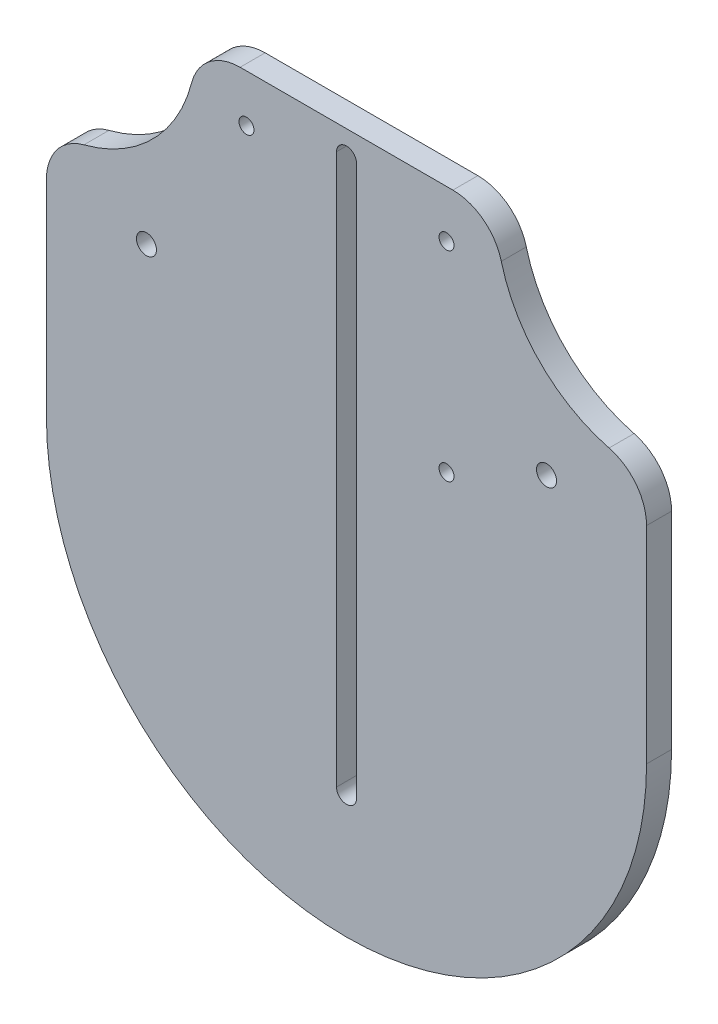
ISO-10303-21;
HEADER;
FILE_DESCRIPTION(('STEP AP214'),'2;1');
FILE_NAME('part.step','',(''),(''),'','','');
FILE_SCHEMA(('AUTOMOTIVE_DESIGN { 1 0 10303 214 1 1 1 1 }'));
ENDSEC;
DATA;
#1=APPLICATION_CONTEXT('core data for automotive mechanical design processes');
#2=APPLICATION_PROTOCOL_DEFINITION('international standard','automotive_design',2000,#1);
#3=PRODUCT_CONTEXT('',#1,'mechanical');
#4=PRODUCT('Part','Part','',(#3));
#5=PRODUCT_RELATED_PRODUCT_CATEGORY('part','',(#4));
#6=PRODUCT_DEFINITION_FORMATION('','',#4);
#7=PRODUCT_DEFINITION_CONTEXT('part definition',#1,'design');
#8=PRODUCT_DEFINITION('design','',#6,#7);
#9=PRODUCT_DEFINITION_SHAPE('','',#8);
#10=(LENGTH_UNIT() NAMED_UNIT(*) SI_UNIT(.MILLI.,.METRE.));
#11=(NAMED_UNIT(*) PLANE_ANGLE_UNIT() SI_UNIT($,.RADIAN.));
#12=(NAMED_UNIT(*) SI_UNIT($,.STERADIAN.) SOLID_ANGLE_UNIT());
#13=UNCERTAINTY_MEASURE_WITH_UNIT(LENGTH_MEASURE(1.E-05),#10,'distance_accuracy_value','');
#14=(GEOMETRIC_REPRESENTATION_CONTEXT(3) GLOBAL_UNCERTAINTY_ASSIGNED_CONTEXT((#13)) GLOBAL_UNIT_ASSIGNED_CONTEXT((#10,
#11,#12)) REPRESENTATION_CONTEXT('',''));
#15=CARTESIAN_POINT('',(0.,0.,0.));
#16=DIRECTION('',(0.,0.,1.));
#17=DIRECTION('',(1.,0.,0.));
#18=AXIS2_PLACEMENT_3D('',#15,#16,#17);
#19=CARTESIAN_POINT('',(60.,-70.,5.));
#20=DIRECTION('',(-1.,0.,0.));
#21=DIRECTION('',(0.,0.,1.));
#22=AXIS2_PLACEMENT_3D('',#19,#20,#21);
#23=PLANE('',#22);
#24=DIRECTION('',(0.,1.,0.));
#25=VECTOR('',#24,1.);
#26=CARTESIAN_POINT('',(60.,-70.,5.));
#27=LINE('',#26,#25);
#28=CARTESIAN_POINT('',(60.,-10.,5.));
#29=VERTEX_POINT('',#28);
#30=CARTESIAN_POINT('',(60.,31.2701665379258,5.));
#31=VERTEX_POINT('',#30);
#32=EDGE_CURVE('E188',#29,#31,#27,.T.);
#33=ORIENTED_EDGE('',*,*,#32,.F.);
#34=DIRECTION('',(0.,0.,-1.));
#35=VECTOR('',#34,1.);
#36=CARTESIAN_POINT('',(60.,-10.,5.));
#37=LINE('',#36,#35);
#38=CARTESIAN_POINT('',(60.,-10.,0.));
#39=VERTEX_POINT('',#38);
#40=EDGE_CURVE('E238',#29,#39,#37,.T.);
#41=ORIENTED_EDGE('',*,*,#40,.T.);
#42=DIRECTION('',(0.,1.,0.));
#43=VECTOR('',#42,1.);
#44=CARTESIAN_POINT('',(60.,-70.,0.));
#45=LINE('',#44,#43);
#46=CARTESIAN_POINT('',(60.,31.2701665379258,0.));
#47=VERTEX_POINT('',#46);
#48=EDGE_CURVE('E187',#39,#47,#45,.T.);
#49=ORIENTED_EDGE('',*,*,#48,.T.);
#50=DIRECTION('',(0.,0.,1.));
#51=VECTOR('',#50,1.);
#52=CARTESIAN_POINT('',(60.,31.2701665379258,5.));
#53=LINE('',#52,#51);
#54=EDGE_CURVE('E225',#47,#31,#53,.T.);
#55=ORIENTED_EDGE('',*,*,#54,.T.);
#56=EDGE_LOOP('',(#33,#41,#49,#55));
#57=FACE_BOUND('',#56,.T.);
#58=ADVANCED_FACE('F33',(#57),#23,.F.);
#59=CARTESIAN_POINT('',(-60.,70.,5.));
#60=DIRECTION('',(0.,-1.,0.));
#61=DIRECTION('',(0.,0.,-1.));
#62=AXIS2_PLACEMENT_3D('',#59,#60,#61);
#63=PLANE('',#62);
#64=DIRECTION('',(-1.,0.,0.));
#65=VECTOR('',#64,1.);
#66=CARTESIAN_POINT('',(-60.,70.,5.));
#67=LINE('',#66,#65);
#68=CARTESIAN_POINT('',(21.2701665379258,70.,5.));
#69=VERTEX_POINT('',#68);
#70=CARTESIAN_POINT('',(-21.2701665379259,70.,5.));
#71=VERTEX_POINT('',#70);
#72=EDGE_CURVE('E190',#69,#71,#67,.T.);
#73=ORIENTED_EDGE('',*,*,#72,.F.);
#74=DIRECTION('',(0.,0.,1.));
#75=VECTOR('',#74,1.);
#76=CARTESIAN_POINT('',(21.2701665379258,70.,5.));
#77=LINE('',#76,#75);
#78=CARTESIAN_POINT('',(21.2701665379258,70.,0.));
#79=VERTEX_POINT('',#78);
#80=EDGE_CURVE('E235',#69,#79,#77,.F.);
#81=ORIENTED_EDGE('',*,*,#80,.T.);
#82=DIRECTION('',(-1.,0.,0.));
#83=VECTOR('',#82,1.);
#84=CARTESIAN_POINT('',(-60.,70.,0.));
#85=LINE('',#84,#83);
#86=CARTESIAN_POINT('',(-21.2701665379259,70.,0.));
#87=VERTEX_POINT('',#86);
#88=EDGE_CURVE('E198',#79,#87,#85,.T.);
#89=ORIENTED_EDGE('',*,*,#88,.T.);
#90=DIRECTION('',(0.,0.,1.));
#91=VECTOR('',#90,1.);
#92=CARTESIAN_POINT('',(-21.2701665379259,70.,5.));
#93=LINE('',#92,#91);
#94=EDGE_CURVE('E232',#87,#71,#93,.T.);
#95=ORIENTED_EDGE('',*,*,#94,.T.);
#96=EDGE_LOOP('',(#73,#81,#89,#95));
#97=FACE_BOUND('',#96,.T.);
#98=ADVANCED_FACE('F325',(#97),#63,.F.);
#99=CARTESIAN_POINT('',(-60.,-70.,5.));
#100=DIRECTION('',(1.,0.,0.));
#101=DIRECTION('',(0.,0.,-1.));
#102=AXIS2_PLACEMENT_3D('',#99,#100,#101);
#103=PLANE('',#102);
#104=DIRECTION('',(0.,-1.,0.));
#105=VECTOR('',#104,1.);
#106=CARTESIAN_POINT('',(-60.,-70.,0.));
#107=LINE('',#106,#105);
#108=CARTESIAN_POINT('',(-60.,31.2701665379258,0.));
#109=VERTEX_POINT('',#108);
#110=CARTESIAN_POINT('',(-60.,-10.,0.));
#111=VERTEX_POINT('',#110);
#112=EDGE_CURVE('E191',#109,#111,#107,.T.);
#113=ORIENTED_EDGE('',*,*,#112,.T.);
#114=DIRECTION('',(0.,0.,-1.));
#115=VECTOR('',#114,1.);
#116=CARTESIAN_POINT('',(-60.,-10.,5.));
#117=LINE('',#116,#115);
#118=CARTESIAN_POINT('',(-60.,-10.,5.));
#119=VERTEX_POINT('',#118);
#120=EDGE_CURVE('E11',#111,#119,#117,.F.);
#121=ORIENTED_EDGE('',*,*,#120,.T.);
#122=DIRECTION('',(0.,-1.,0.));
#123=VECTOR('',#122,1.);
#124=CARTESIAN_POINT('',(-60.,-70.,5.));
#125=LINE('',#124,#123);
#126=CARTESIAN_POINT('',(-60.,31.2701665379258,5.));
#127=VERTEX_POINT('',#126);
#128=EDGE_CURVE('E194',#127,#119,#125,.T.);
#129=ORIENTED_EDGE('',*,*,#128,.F.);
#130=DIRECTION('',(0.,0.,1.));
#131=VECTOR('',#130,1.);
#132=CARTESIAN_POINT('',(-60.,31.2701665379258,5.));
#133=LINE('',#132,#131);
#134=EDGE_CURVE('E196',#127,#109,#133,.F.);
#135=ORIENTED_EDGE('',*,*,#134,.T.);
#136=EDGE_LOOP('',(#113,#121,#129,#135));
#137=FACE_BOUND('',#136,.T.);
#138=ADVANCED_FACE('F330',(#137),#103,.F.);
#139=CARTESIAN_POINT('',(0.,0.,5.));
#140=DIRECTION('',(0.,0.,-1.));
#141=DIRECTION('',(-1.,0.,0.));
#142=AXIS2_PLACEMENT_3D('',#139,#140,#141);
#143=PLANE('',#142);
#144=CARTESIAN_POINT('',(20.,20.5,5.));
#145=DIRECTION('',(0.,0.,1.));
#146=DIRECTION('',(1.,0.,0.));
#147=AXIS2_PLACEMENT_3D('',#144,#145,#146);
#148=CIRCLE('',#147,1.5);
#149=CARTESIAN_POINT('',(21.5,20.5,5.));
#150=VERTEX_POINT('',#149);
#151=EDGE_CURVE('E287',#150,#150,#148,.T.);
#152=ORIENTED_EDGE('',*,*,#151,.F.);
#153=EDGE_LOOP('',(#152));
#154=FACE_BOUND('',#153,.T.);
#155=CARTESIAN_POINT('',(20.,60.5,5.));
#156=DIRECTION('',(0.,0.,1.));
#157=DIRECTION('',(1.,0.,0.));
#158=AXIS2_PLACEMENT_3D('',#155,#156,#157);
#159=CIRCLE('',#158,1.5);
#160=CARTESIAN_POINT('',(21.5,60.5,5.));
#161=VERTEX_POINT('',#160);
#162=EDGE_CURVE('E293',#161,#161,#159,.T.);
#163=ORIENTED_EDGE('',*,*,#162,.F.);
#164=EDGE_LOOP('',(#163));
#165=FACE_BOUND('',#164,.T.);
#166=CARTESIAN_POINT('',(-20.,60.5,5.));
#167=DIRECTION('',(0.,0.,1.));
#168=DIRECTION('',(1.,0.,0.));
#169=AXIS2_PLACEMENT_3D('',#166,#167,#168);
#170=CIRCLE('',#169,1.5);
#171=CARTESIAN_POINT('',(-18.5,60.5,5.));
#172=VERTEX_POINT('',#171);
#173=EDGE_CURVE('E299',#172,#172,#170,.T.);
#174=ORIENTED_EDGE('',*,*,#173,.F.);
#175=EDGE_LOOP('',(#174));
#176=FACE_BOUND('',#175,.T.);
#177=CARTESIAN_POINT('',(0.,65.,5.));
#178=DIRECTION('',(0.,0.,1.));
#179=DIRECTION('',(1.,0.,0.));
#180=AXIS2_PLACEMENT_3D('',#177,#178,#179);
#181=CIRCLE('',#180,2.);
#182=CARTESIAN_POINT('',(1.99999999999998,65.0000000263186,5.));
#183=VERTEX_POINT('',#182);
#184=CARTESIAN_POINT('',(-2.,65.0000000263186,5.));
#185=VERTEX_POINT('',#184);
#186=EDGE_CURVE('E159',#183,#185,#181,.T.);
#187=ORIENTED_EDGE('',*,*,#186,.F.);
#188=DIRECTION('',(0.,1.,0.));
#189=VECTOR('',#188,1.);
#190=CARTESIAN_POINT('',(1.99999999999998,65.0000000263186,5.));
#191=LINE('',#190,#189);
#192=CARTESIAN_POINT('',(2.,-45.0000005346875,5.));
#193=VERTEX_POINT('',#192);
#194=EDGE_CURVE('E162',#193,#183,#191,.T.);
#195=ORIENTED_EDGE('',*,*,#194,.F.);
#196=CARTESIAN_POINT('',(0.,-45.,5.));
#197=DIRECTION('',(0.,0.,1.));
#198=DIRECTION('',(1.,0.,0.));
#199=AXIS2_PLACEMENT_3D('',#196,#197,#198);
#200=CIRCLE('',#199,2.);
#201=CARTESIAN_POINT('',(-2.,-45.,5.));
#202=VERTEX_POINT('',#201);
#203=EDGE_CURVE('E161',#202,#193,#200,.T.);
#204=ORIENTED_EDGE('',*,*,#203,.F.);
#205=DIRECTION('',(0.,-1.,0.));
#206=VECTOR('',#205,1.);
#207=CARTESIAN_POINT('',(-2.,65.0000000263186,5.));
#208=LINE('',#207,#206);
#209=EDGE_CURVE('E143',#185,#202,#208,.T.);
#210=ORIENTED_EDGE('',*,*,#209,.F.);
#211=EDGE_LOOP('',(#187,#195,#204,#210));
#212=FACE_BOUND('',#211,.T.);
#213=CARTESIAN_POINT('',(40.,30.,5.));
#214=DIRECTION('',(0.,0.,1.));
#215=DIRECTION('',(1.,0.,0.));
#216=AXIS2_PLACEMENT_3D('',#213,#214,#215);
#217=CIRCLE('',#216,2.);
#218=CARTESIAN_POINT('',(42.,30.,5.));
#219=VERTEX_POINT('',#218);
#220=EDGE_CURVE('E170',#219,#219,#217,.T.);
#221=ORIENTED_EDGE('',*,*,#220,.F.);
#222=EDGE_LOOP('',(#221));
#223=FACE_BOUND('',#222,.T.);
#224=CARTESIAN_POINT('',(-40.,30.,5.));
#225=DIRECTION('',(0.,0.,1.));
#226=DIRECTION('',(1.,0.,0.));
#227=AXIS2_PLACEMENT_3D('',#224,#225,#226);
#228=CIRCLE('',#227,2.);
#229=CARTESIAN_POINT('',(-38.,30.,5.));
#230=VERTEX_POINT('',#229);
#231=EDGE_CURVE('E181',#230,#230,#228,.T.);
#232=ORIENTED_EDGE('',*,*,#231,.F.);
#233=EDGE_LOOP('',(#232));
#234=FACE_BOUND('',#233,.T.);
#235=CARTESIAN_POINT('',(0.,-10.,5.));
#236=DIRECTION('',(0.,0.,-1.));
#237=DIRECTION('',(-1.,0.,0.));
#238=AXIS2_PLACEMENT_3D('',#235,#236,#237);
#239=CIRCLE('',#238,60.);
#240=CARTESIAN_POINT('',(0.,-70.,5.));
#241=VERTEX_POINT('',#240);
#242=EDGE_CURVE('E49',#119,#241,#239,.F.);
#243=ORIENTED_EDGE('',*,*,#242,.T.);
#244=CARTESIAN_POINT('',(0.,-10.,5.));
#245=DIRECTION('',(0.,0.,-1.));
#246=DIRECTION('',(-1.,0.,0.));
#247=AXIS2_PLACEMENT_3D('',#244,#245,#246);
#248=CIRCLE('',#247,60.);
#249=EDGE_CURVE('E42',#241,#29,#248,.F.);
#250=ORIENTED_EDGE('',*,*,#249,.T.);
#251=ORIENTED_EDGE('',*,*,#32,.T.);
#252=CARTESIAN_POINT('',(50.,31.2701665379258,5.));
#253=DIRECTION('',(0.,0.,-1.));
#254=DIRECTION('',(-1.,0.,0.));
#255=AXIS2_PLACEMENT_3D('',#252,#253,#254);
#256=CIRCLE('',#255,10.);
#257=CARTESIAN_POINT('',(52.5,40.9526249034444,5.));
#258=VERTEX_POINT('',#257);
#259=EDGE_CURVE('E221',#31,#258,#256,.F.);
#260=ORIENTED_EDGE('',*,*,#259,.T.);
#261=CARTESIAN_POINT('',(60.,70.,5.));
#262=DIRECTION('',(0.,0.,1.));
#263=DIRECTION('',(1.,0.,0.));
#264=AXIS2_PLACEMENT_3D('',#261,#262,#263);
#265=CIRCLE('',#264,30.);
#266=CARTESIAN_POINT('',(30.9526249034444,62.5,5.));
#267=VERTEX_POINT('',#266);
#268=EDGE_CURVE('E262',#267,#258,#265,.T.);
#269=ORIENTED_EDGE('',*,*,#268,.F.);
#270=CARTESIAN_POINT('',(21.2701665379258,60.,5.));
#271=DIRECTION('',(0.,0.,-1.));
#272=DIRECTION('',(-1.,0.,0.));
#273=AXIS2_PLACEMENT_3D('',#270,#271,#272);
#274=CIRCLE('',#273,10.);
#275=EDGE_CURVE('E219',#267,#69,#274,.F.);
#276=ORIENTED_EDGE('',*,*,#275,.T.);
#277=ORIENTED_EDGE('',*,*,#72,.T.);
#278=CARTESIAN_POINT('',(-21.2701665379259,60.,5.));
#279=DIRECTION('',(0.,0.,-1.));
#280=DIRECTION('',(-1.,0.,0.));
#281=AXIS2_PLACEMENT_3D('',#278,#279,#280);
#282=CIRCLE('',#281,10.);
#283=CARTESIAN_POINT('',(-30.9526249034444,62.5,5.));
#284=VERTEX_POINT('',#283);
#285=EDGE_CURVE('E217',#71,#284,#282,.F.);
#286=ORIENTED_EDGE('',*,*,#285,.T.);
#287=CARTESIAN_POINT('',(-60.,70.,5.));
#288=DIRECTION('',(0.,0.,1.));
#289=DIRECTION('',(1.,0.,0.));
#290=AXIS2_PLACEMENT_3D('',#287,#288,#289);
#291=CIRCLE('',#290,30.);
#292=CARTESIAN_POINT('',(-52.5,40.9526249034444,5.));
#293=VERTEX_POINT('',#292);
#294=EDGE_CURVE('E270',#293,#284,#291,.T.);
#295=ORIENTED_EDGE('',*,*,#294,.F.);
#296=CARTESIAN_POINT('',(-50.,31.2701665379258,5.));
#297=DIRECTION('',(0.,0.,-1.));
#298=DIRECTION('',(-1.,0.,0.));
#299=AXIS2_PLACEMENT_3D('',#296,#297,#298);
#300=CIRCLE('',#299,10.);
#301=EDGE_CURVE('E223',#293,#127,#300,.F.);
#302=ORIENTED_EDGE('',*,*,#301,.T.);
#303=ORIENTED_EDGE('',*,*,#128,.T.);
#304=EDGE_LOOP('',(#243,#250,#251,#260,#269,#276,#277,#286,#295,#302,#303));
#305=FACE_BOUND('',#304,.T.);
#306=ADVANCED_FACE('F156',(#154,#165,#176,#212,#223,#234,#305),#143,.F.);
#307=CARTESIAN_POINT('',(0.,0.,0.));
#308=DIRECTION('',(0.,0.,-1.));
#309=DIRECTION('',(-1.,0.,0.));
#310=AXIS2_PLACEMENT_3D('',#307,#308,#309);
#311=PLANE('',#310);
#312=ORIENTED_EDGE('',*,*,#48,.F.);
#313=CARTESIAN_POINT('',(0.,-10.,0.));
#314=DIRECTION('',(0.,0.,-1.));
#315=DIRECTION('',(-1.,0.,0.));
#316=AXIS2_PLACEMENT_3D('',#313,#314,#315);
#317=CIRCLE('',#316,60.);
#318=CARTESIAN_POINT('',(0.,-70.,0.));
#319=VERTEX_POINT('',#318);
#320=EDGE_CURVE('E243',#39,#319,#317,.T.);
#321=ORIENTED_EDGE('',*,*,#320,.T.);
#322=CARTESIAN_POINT('',(0.,-10.,0.));
#323=DIRECTION('',(0.,0.,-1.));
#324=DIRECTION('',(-1.,0.,0.));
#325=AXIS2_PLACEMENT_3D('',#322,#323,#324);
#326=CIRCLE('',#325,60.);
#327=EDGE_CURVE('E241',#319,#111,#326,.T.);
#328=ORIENTED_EDGE('',*,*,#327,.T.);
#329=ORIENTED_EDGE('',*,*,#112,.F.);
#330=CARTESIAN_POINT('',(-50.,31.2701665379258,0.));
#331=DIRECTION('',(0.,0.,-1.));
#332=DIRECTION('',(-1.,0.,0.));
#333=AXIS2_PLACEMENT_3D('',#330,#331,#332);
#334=CIRCLE('',#333,10.);
#335=CARTESIAN_POINT('',(-52.5,40.9526249034444,0.));
#336=VERTEX_POINT('',#335);
#337=EDGE_CURVE('E211',#109,#336,#334,.T.);
#338=ORIENTED_EDGE('',*,*,#337,.T.);
#339=CARTESIAN_POINT('',(-60.,70.,0.));
#340=DIRECTION('',(0.,0.,-1.));
#341=DIRECTION('',(-1.,0.,0.));
#342=AXIS2_PLACEMENT_3D('',#339,#340,#341);
#343=CIRCLE('',#342,30.);
#344=CARTESIAN_POINT('',(-30.9526249034444,62.5,0.));
#345=VERTEX_POINT('',#344);
#346=EDGE_CURVE('E163',#336,#345,#343,.F.);
#347=ORIENTED_EDGE('',*,*,#346,.T.);
#348=CARTESIAN_POINT('',(-21.2701665379259,60.,0.));
#349=DIRECTION('',(0.,0.,-1.));
#350=DIRECTION('',(-1.,0.,0.));
#351=AXIS2_PLACEMENT_3D('',#348,#349,#350);
#352=CIRCLE('',#351,10.);
#353=EDGE_CURVE('E204',#345,#87,#352,.T.);
#354=ORIENTED_EDGE('',*,*,#353,.T.);
#355=ORIENTED_EDGE('',*,*,#88,.F.);
#356=CARTESIAN_POINT('',(21.2701665379258,60.,0.));
#357=DIRECTION('',(0.,0.,-1.));
#358=DIRECTION('',(-1.,0.,0.));
#359=AXIS2_PLACEMENT_3D('',#356,#357,#358);
#360=CIRCLE('',#359,10.);
#361=CARTESIAN_POINT('',(30.9526249034444,62.5,0.));
#362=VERTEX_POINT('',#361);
#363=EDGE_CURVE('E206',#79,#362,#360,.T.);
#364=ORIENTED_EDGE('',*,*,#363,.T.);
#365=CARTESIAN_POINT('',(60.,70.,0.));
#366=DIRECTION('',(0.,0.,-1.));
#367=DIRECTION('',(-1.,0.,0.));
#368=AXIS2_PLACEMENT_3D('',#365,#366,#367);
#369=CIRCLE('',#368,30.);
#370=CARTESIAN_POINT('',(52.5,40.9526249034444,0.));
#371=VERTEX_POINT('',#370);
#372=EDGE_CURVE('E264',#362,#371,#369,.F.);
#373=ORIENTED_EDGE('',*,*,#372,.T.);
#374=CARTESIAN_POINT('',(50.,31.2701665379258,0.));
#375=DIRECTION('',(0.,0.,-1.));
#376=DIRECTION('',(-1.,0.,0.));
#377=AXIS2_PLACEMENT_3D('',#374,#375,#376);
#378=CIRCLE('',#377,10.);
#379=EDGE_CURVE('E208',#371,#47,#378,.T.);
#380=ORIENTED_EDGE('',*,*,#379,.T.);
#381=EDGE_LOOP('',(#312,#321,#328,#329,#338,#347,#354,#355,#364,#373,#380));
#382=FACE_BOUND('',#381,.T.);
#383=DIRECTION('',(0.,1.,0.));
#384=VECTOR('',#383,1.);
#385=CARTESIAN_POINT('',(1.99999999999998,65.0000000263186,0.));
#386=LINE('',#385,#384);
#387=CARTESIAN_POINT('',(2.,-45.,0.));
#388=VERTEX_POINT('',#387);
#389=CARTESIAN_POINT('',(1.99999999999998,65.0000000263186,0.));
#390=VERTEX_POINT('',#389);
#391=EDGE_CURVE('E281',#388,#390,#386,.T.);
#392=ORIENTED_EDGE('',*,*,#391,.T.);
#393=CARTESIAN_POINT('',(0.,65.,0.));
#394=DIRECTION('',(0.,0.,-1.));
#395=DIRECTION('',(-1.,0.,0.));
#396=AXIS2_PLACEMENT_3D('',#393,#394,#395);
#397=CIRCLE('',#396,2.);
#398=CARTESIAN_POINT('',(-2.,65.0000000263186,0.));
#399=VERTEX_POINT('',#398);
#400=EDGE_CURVE('E167',#390,#399,#397,.F.);
#401=ORIENTED_EDGE('',*,*,#400,.T.);
#402=DIRECTION('',(0.,-1.,0.));
#403=VECTOR('',#402,1.);
#404=CARTESIAN_POINT('',(-2.,65.0000000263186,0.));
#405=LINE('',#404,#403);
#406=CARTESIAN_POINT('',(-2.,-45.0000005346875,0.));
#407=VERTEX_POINT('',#406);
#408=EDGE_CURVE('E146',#399,#407,#405,.T.);
#409=ORIENTED_EDGE('',*,*,#408,.T.);
#410=CARTESIAN_POINT('',(0.,-45.,0.));
#411=DIRECTION('',(0.,0.,-1.));
#412=DIRECTION('',(-1.,0.,0.));
#413=AXIS2_PLACEMENT_3D('',#410,#411,#412);
#414=CIRCLE('',#413,2.);
#415=EDGE_CURVE('E168',#407,#388,#414,.F.);
#416=ORIENTED_EDGE('',*,*,#415,.T.);
#417=EDGE_LOOP('',(#392,#401,#409,#416));
#418=FACE_BOUND('',#417,.T.);
#419=CARTESIAN_POINT('',(20.,20.5,0.));
#420=DIRECTION('',(0.,0.,-1.));
#421=DIRECTION('',(-1.,0.,0.));
#422=AXIS2_PLACEMENT_3D('',#419,#420,#421);
#423=CIRCLE('',#422,1.5);
#424=CARTESIAN_POINT('',(18.5,20.5,0.));
#425=VERTEX_POINT('',#424);
#426=EDGE_CURVE('E290',#425,#425,#423,.F.);
#427=ORIENTED_EDGE('',*,*,#426,.T.);
#428=EDGE_LOOP('',(#427));
#429=FACE_BOUND('',#428,.T.);
#430=CARTESIAN_POINT('',(20.,60.5,0.));
#431=DIRECTION('',(0.,0.,-1.));
#432=DIRECTION('',(-1.,0.,0.));
#433=AXIS2_PLACEMENT_3D('',#430,#431,#432);
#434=CIRCLE('',#433,1.5);
#435=CARTESIAN_POINT('',(18.5,60.5,0.));
#436=VERTEX_POINT('',#435);
#437=EDGE_CURVE('E296',#436,#436,#434,.F.);
#438=ORIENTED_EDGE('',*,*,#437,.T.);
#439=EDGE_LOOP('',(#438));
#440=FACE_BOUND('',#439,.T.);
#441=CARTESIAN_POINT('',(-20.,60.5,0.));
#442=DIRECTION('',(0.,0.,-1.));
#443=DIRECTION('',(-1.,0.,0.));
#444=AXIS2_PLACEMENT_3D('',#441,#442,#443);
#445=CIRCLE('',#444,1.5);
#446=CARTESIAN_POINT('',(-21.5,60.5,0.));
#447=VERTEX_POINT('',#446);
#448=EDGE_CURVE('E302',#447,#447,#445,.F.);
#449=ORIENTED_EDGE('',*,*,#448,.T.);
#450=EDGE_LOOP('',(#449));
#451=FACE_BOUND('',#450,.T.);
#452=CARTESIAN_POINT('',(40.,30.,0.));
#453=DIRECTION('',(0.,0.,-1.));
#454=DIRECTION('',(-1.,0.,0.));
#455=AXIS2_PLACEMENT_3D('',#452,#453,#454);
#456=CIRCLE('',#455,2.);
#457=CARTESIAN_POINT('',(38.,30.,0.));
#458=VERTEX_POINT('',#457);
#459=EDGE_CURVE('E178',#458,#458,#456,.F.);
#460=ORIENTED_EDGE('',*,*,#459,.T.);
#461=EDGE_LOOP('',(#460));
#462=FACE_BOUND('',#461,.T.);
#463=CARTESIAN_POINT('',(-40.,30.,0.));
#464=DIRECTION('',(0.,0.,-1.));
#465=DIRECTION('',(-1.,0.,0.));
#466=AXIS2_PLACEMENT_3D('',#463,#464,#465);
#467=CIRCLE('',#466,2.);
#468=CARTESIAN_POINT('',(-42.,30.,0.));
#469=VERTEX_POINT('',#468);
#470=EDGE_CURVE('E184',#469,#469,#467,.F.);
#471=ORIENTED_EDGE('',*,*,#470,.T.);
#472=EDGE_LOOP('',(#471));
#473=FACE_BOUND('',#472,.T.);
#474=ADVANCED_FACE('F258',(#382,#418,#429,#440,#451,#462,#473),#311,.T.);
#475=CARTESIAN_POINT('',(-40.,30.,-5.65685424949239));
#476=DIRECTION('',(0.,0.,1.));
#477=DIRECTION('',(1.,0.,0.));
#478=AXIS2_PLACEMENT_3D('',#475,#476,#477);
#479=CYLINDRICAL_SURFACE('',#478,2.);
#480=ORIENTED_EDGE('',*,*,#231,.T.);
#481=EDGE_LOOP('',(#480));
#482=FACE_BOUND('',#481,.T.);
#483=ORIENTED_EDGE('',*,*,#470,.F.);
#484=EDGE_LOOP('',(#483));
#485=FACE_BOUND('',#484,.T.);
#486=ADVANCED_FACE('F456',(#482,#485),#479,.F.);
#487=CARTESIAN_POINT('',(40.,30.,-5.65685424949239));
#488=DIRECTION('',(0.,0.,1.));
#489=DIRECTION('',(1.,0.,0.));
#490=AXIS2_PLACEMENT_3D('',#487,#488,#489);
#491=CYLINDRICAL_SURFACE('',#490,2.);
#492=ORIENTED_EDGE('',*,*,#220,.T.);
#493=EDGE_LOOP('',(#492));
#494=FACE_BOUND('',#493,.T.);
#495=ORIENTED_EDGE('',*,*,#459,.F.);
#496=EDGE_LOOP('',(#495));
#497=FACE_BOUND('',#496,.T.);
#498=ADVANCED_FACE('F424',(#494,#497),#491,.F.);
#499=CARTESIAN_POINT('',(0.,65.,-5.65685424949239));
#500=DIRECTION('',(0.,0.,1.));
#501=DIRECTION('',(1.,0.,0.));
#502=AXIS2_PLACEMENT_3D('',#499,#500,#501);
#503=CYLINDRICAL_SURFACE('',#502,2.);
#504=ORIENTED_EDGE('',*,*,#400,.F.);
#505=DIRECTION('',(0.,0.,1.));
#506=VECTOR('',#505,1.);
#507=CARTESIAN_POINT('',(1.99999999999998,65.0000000263186,-110.072703807172));
#508=LINE('',#507,#506);
#509=EDGE_CURVE('E151',#390,#183,#508,.T.);
#510=ORIENTED_EDGE('',*,*,#509,.T.);
#511=ORIENTED_EDGE('',*,*,#186,.T.);
#512=DIRECTION('',(0.,0.,1.));
#513=VECTOR('',#512,1.);
#514=CARTESIAN_POINT('',(-2.,65.0000000263186,-110.072703807172));
#515=LINE('',#514,#513);
#516=EDGE_CURVE('E140',#399,#185,#515,.T.);
#517=ORIENTED_EDGE('',*,*,#516,.F.);
#518=EDGE_LOOP('',(#504,#510,#511,#517));
#519=FACE_BOUND('',#518,.T.);
#520=ADVANCED_FACE('F166',(#519),#503,.F.);
#521=CARTESIAN_POINT('',(0.,-45.,-5.65685424949239));
#522=DIRECTION('',(0.,0.,1.));
#523=DIRECTION('',(1.,0.,0.));
#524=AXIS2_PLACEMENT_3D('',#521,#522,#523);
#525=CYLINDRICAL_SURFACE('',#524,2.);
#526=ORIENTED_EDGE('',*,*,#203,.T.);
#527=DIRECTION('',(0.,0.,1.));
#528=VECTOR('',#527,1.);
#529=CARTESIAN_POINT('',(2.,-45.0000005346875,-110.072703807172));
#530=LINE('',#529,#528);
#531=EDGE_CURVE('E277',#388,#193,#530,.T.);
#532=ORIENTED_EDGE('',*,*,#531,.F.);
#533=ORIENTED_EDGE('',*,*,#415,.F.);
#534=DIRECTION('',(0.,0.,1.));
#535=VECTOR('',#534,1.);
#536=CARTESIAN_POINT('',(-2.,-45.0000005346875,-110.072703807172));
#537=LINE('',#536,#535);
#538=EDGE_CURVE('E280',#407,#202,#537,.T.);
#539=ORIENTED_EDGE('',*,*,#538,.T.);
#540=EDGE_LOOP('',(#526,#532,#533,#539));
#541=FACE_BOUND('',#540,.T.);
#542=ADVANCED_FACE('F306',(#541),#525,.F.);
#543=CARTESIAN_POINT('',(-20.,60.5,-5.65685424949239));
#544=DIRECTION('',(0.,0.,1.));
#545=DIRECTION('',(1.,0.,0.));
#546=AXIS2_PLACEMENT_3D('',#543,#544,#545);
#547=CYLINDRICAL_SURFACE('',#546,1.5);
#548=ORIENTED_EDGE('',*,*,#173,.T.);
#549=EDGE_LOOP('',(#548));
#550=FACE_BOUND('',#549,.T.);
#551=ORIENTED_EDGE('',*,*,#448,.F.);
#552=EDGE_LOOP('',(#551));
#553=FACE_BOUND('',#552,.T.);
#554=ADVANCED_FACE('F413',(#550,#553),#547,.F.);
#555=CARTESIAN_POINT('',(20.,60.5,-5.65685424949239));
#556=DIRECTION('',(0.,0.,1.));
#557=DIRECTION('',(1.,0.,0.));
#558=AXIS2_PLACEMENT_3D('',#555,#556,#557);
#559=CYLINDRICAL_SURFACE('',#558,1.5);
#560=ORIENTED_EDGE('',*,*,#162,.T.);
#561=EDGE_LOOP('',(#560));
#562=FACE_BOUND('',#561,.T.);
#563=ORIENTED_EDGE('',*,*,#437,.F.);
#564=EDGE_LOOP('',(#563));
#565=FACE_BOUND('',#564,.T.);
#566=ADVANCED_FACE('F433',(#562,#565),#559,.F.);
#567=CARTESIAN_POINT('',(20.,20.5,-5.65685424949239));
#568=DIRECTION('',(0.,0.,1.));
#569=DIRECTION('',(1.,0.,0.));
#570=AXIS2_PLACEMENT_3D('',#567,#568,#569);
#571=CYLINDRICAL_SURFACE('',#570,1.5);
#572=ORIENTED_EDGE('',*,*,#151,.T.);
#573=EDGE_LOOP('',(#572));
#574=FACE_BOUND('',#573,.T.);
#575=ORIENTED_EDGE('',*,*,#426,.F.);
#576=EDGE_LOOP('',(#575));
#577=FACE_BOUND('',#576,.T.);
#578=ADVANCED_FACE('F321',(#574,#577),#571,.F.);
#579=CARTESIAN_POINT('',(-2.,65.0000000263186,-110.072703807172));
#580=DIRECTION('',(-1.,0.,0.));
#581=DIRECTION('',(0.,-1.,0.));
#582=AXIS2_PLACEMENT_3D('',#579,#580,#581);
#583=PLANE('',#582);
#584=ORIENTED_EDGE('',*,*,#516,.T.);
#585=ORIENTED_EDGE('',*,*,#209,.T.);
#586=ORIENTED_EDGE('',*,*,#538,.F.);
#587=ORIENTED_EDGE('',*,*,#408,.F.);
#588=EDGE_LOOP('',(#584,#585,#586,#587));
#589=FACE_BOUND('',#588,.T.);
#590=ADVANCED_FACE('F142',(#589),#583,.F.);
#591=CARTESIAN_POINT('',(1.99999999999998,65.0000000263186,-110.072703807172));
#592=DIRECTION('',(1.,0.,0.));
#593=DIRECTION('',(0.,1.,0.));
#594=AXIS2_PLACEMENT_3D('',#591,#592,#593);
#595=PLANE('',#594);
#596=ORIENTED_EDGE('',*,*,#531,.T.);
#597=ORIENTED_EDGE('',*,*,#194,.T.);
#598=ORIENTED_EDGE('',*,*,#509,.F.);
#599=ORIENTED_EDGE('',*,*,#391,.F.);
#600=EDGE_LOOP('',(#596,#597,#598,#599));
#601=FACE_BOUND('',#600,.T.);
#602=ADVANCED_FACE('F310',(#601),#595,.F.);
#603=CARTESIAN_POINT('',(-60.,70.,-84.8528137423857));
#604=DIRECTION('',(0.,0.,1.));
#605=DIRECTION('',(1.,0.,0.));
#606=AXIS2_PLACEMENT_3D('',#603,#604,#605);
#607=CYLINDRICAL_SURFACE('',#606,30.);
#608=ORIENTED_EDGE('',*,*,#346,.F.);
#609=DIRECTION('',(0.,0.,1.));
#610=VECTOR('',#609,1.);
#611=CARTESIAN_POINT('',(-52.5,40.9526249034444,-84.8528137423857));
#612=LINE('',#611,#610);
#613=EDGE_CURVE('E215',#336,#293,#612,.T.);
#614=ORIENTED_EDGE('',*,*,#613,.T.);
#615=ORIENTED_EDGE('',*,*,#294,.T.);
#616=DIRECTION('',(0.,0.,1.));
#617=VECTOR('',#616,1.);
#618=CARTESIAN_POINT('',(-30.9526249034444,62.5,-84.8528137423857));
#619=LINE('',#618,#617);
#620=EDGE_CURVE('E213',#284,#345,#619,.F.);
#621=ORIENTED_EDGE('',*,*,#620,.T.);
#622=EDGE_LOOP('',(#608,#614,#615,#621));
#623=FACE_BOUND('',#622,.T.);
#624=ADVANCED_FACE('F312',(#623),#607,.F.);
#625=CARTESIAN_POINT('',(60.,70.,-84.8528137423857));
#626=DIRECTION('',(0.,0.,1.));
#627=DIRECTION('',(1.,0.,0.));
#628=AXIS2_PLACEMENT_3D('',#625,#626,#627);
#629=CYLINDRICAL_SURFACE('',#628,30.);
#630=ORIENTED_EDGE('',*,*,#268,.T.);
#631=DIRECTION('',(0.,0.,1.));
#632=VECTOR('',#631,1.);
#633=CARTESIAN_POINT('',(52.5,40.9526249034444,-84.8528137423857));
#634=LINE('',#633,#632);
#635=EDGE_CURVE('E230',#258,#371,#634,.F.);
#636=ORIENTED_EDGE('',*,*,#635,.T.);
#637=ORIENTED_EDGE('',*,*,#372,.F.);
#638=DIRECTION('',(0.,0.,1.));
#639=VECTOR('',#638,1.);
#640=CARTESIAN_POINT('',(30.9526249034444,62.5,-84.8528137423857));
#641=LINE('',#640,#639);
#642=EDGE_CURVE('E228',#362,#267,#641,.T.);
#643=ORIENTED_EDGE('',*,*,#642,.T.);
#644=EDGE_LOOP('',(#630,#636,#637,#643));
#645=FACE_BOUND('',#644,.T.);
#646=ADVANCED_FACE('F318',(#645),#629,.F.);
#647=CARTESIAN_POINT('',(-50.,31.2701665379258,-84.8528137423857));
#648=DIRECTION('',(0.,0.,1.));
#649=DIRECTION('',(1.,0.,0.));
#650=AXIS2_PLACEMENT_3D('',#647,#648,#649);
#651=CYLINDRICAL_SURFACE('',#650,10.);
#652=ORIENTED_EDGE('',*,*,#301,.F.);
#653=ORIENTED_EDGE('',*,*,#613,.F.);
#654=ORIENTED_EDGE('',*,*,#337,.F.);
#655=ORIENTED_EDGE('',*,*,#134,.F.);
#656=EDGE_LOOP('',(#652,#653,#654,#655));
#657=FACE_BOUND('',#656,.T.);
#658=ADVANCED_FACE('F335',(#657),#651,.T.);
#659=CARTESIAN_POINT('',(50.,31.2701665379258,-84.8528137423857));
#660=DIRECTION('',(0.,0.,1.));
#661=DIRECTION('',(1.,0.,0.));
#662=AXIS2_PLACEMENT_3D('',#659,#660,#661);
#663=CYLINDRICAL_SURFACE('',#662,10.);
#664=ORIENTED_EDGE('',*,*,#379,.F.);
#665=ORIENTED_EDGE('',*,*,#635,.F.);
#666=ORIENTED_EDGE('',*,*,#259,.F.);
#667=ORIENTED_EDGE('',*,*,#54,.F.);
#668=EDGE_LOOP('',(#664,#665,#666,#667));
#669=FACE_BOUND('',#668,.T.);
#670=ADVANCED_FACE('F338',(#669),#663,.T.);
#671=CARTESIAN_POINT('',(21.2701665379258,60.,-84.8528137423857));
#672=DIRECTION('',(0.,0.,1.));
#673=DIRECTION('',(1.,0.,0.));
#674=AXIS2_PLACEMENT_3D('',#671,#672,#673);
#675=CYLINDRICAL_SURFACE('',#674,10.);
#676=ORIENTED_EDGE('',*,*,#275,.F.);
#677=ORIENTED_EDGE('',*,*,#642,.F.);
#678=ORIENTED_EDGE('',*,*,#363,.F.);
#679=ORIENTED_EDGE('',*,*,#80,.F.);
#680=EDGE_LOOP('',(#676,#677,#678,#679));
#681=FACE_BOUND('',#680,.T.);
#682=ADVANCED_FACE('F342',(#681),#675,.T.);
#683=CARTESIAN_POINT('',(-21.2701665379259,60.,-84.8528137423857));
#684=DIRECTION('',(0.,0.,1.));
#685=DIRECTION('',(1.,0.,0.));
#686=AXIS2_PLACEMENT_3D('',#683,#684,#685);
#687=CYLINDRICAL_SURFACE('',#686,10.);
#688=ORIENTED_EDGE('',*,*,#353,.F.);
#689=ORIENTED_EDGE('',*,*,#620,.F.);
#690=ORIENTED_EDGE('',*,*,#285,.F.);
#691=ORIENTED_EDGE('',*,*,#94,.F.);
#692=EDGE_LOOP('',(#688,#689,#690,#691));
#693=FACE_BOUND('',#692,.T.);
#694=ADVANCED_FACE('F346',(#693),#687,.T.);
#695=CARTESIAN_POINT('',(0.,-10.,5.));
#696=DIRECTION('',(0.,0.,-1.));
#697=DIRECTION('',(-1.,0.,0.));
#698=AXIS2_PLACEMENT_3D('',#695,#696,#697);
#699=CYLINDRICAL_SURFACE('',#698,60.);
#700=DIRECTION('',(0.,0.,-1.));
#701=VECTOR('',#700,1.);
#702=CARTESIAN_POINT('',(0.,-70.,5.));
#703=LINE('',#702,#701);
#704=EDGE_CURVE('E37',#241,#319,#703,.T.);
#705=ORIENTED_EDGE('',*,*,#704,.F.);
#706=ORIENTED_EDGE('',*,*,#242,.F.);
#707=ORIENTED_EDGE('',*,*,#120,.F.);
#708=ORIENTED_EDGE('',*,*,#327,.F.);
#709=EDGE_LOOP('',(#705,#706,#707,#708));
#710=FACE_BOUND('',#709,.T.);
#711=ADVANCED_FACE('F35',(#710),#699,.T.);
#712=CARTESIAN_POINT('',(0.,-10.,5.));
#713=DIRECTION('',(0.,0.,-1.));
#714=DIRECTION('',(-1.,0.,0.));
#715=AXIS2_PLACEMENT_3D('',#712,#713,#714);
#716=CYLINDRICAL_SURFACE('',#715,60.);
#717=ORIENTED_EDGE('',*,*,#249,.F.);
#718=ORIENTED_EDGE('',*,*,#704,.T.);
#719=ORIENTED_EDGE('',*,*,#320,.F.);
#720=ORIENTED_EDGE('',*,*,#40,.F.);
#721=EDGE_LOOP('',(#717,#718,#719,#720));
#722=FACE_BOUND('',#721,.T.);
#723=ADVANCED_FACE('F255',(#722),#716,.T.);
#724=CLOSED_SHELL('',(#58,#98,#138,#306,#474,#486,#498,#520,#542,#554,#566,#578,#590,#602,#624,
#646,#658,#670,#682,#694,#711,#723));
#725=MANIFOLD_SOLID_BREP('B2',#724);
#726=ADVANCED_BREP_SHAPE_REPRESENTATION('',(#18,#725),#14);
#727=SHAPE_DEFINITION_REPRESENTATION(#9,#726);
ENDSEC;
END-ISO-10303-21;
